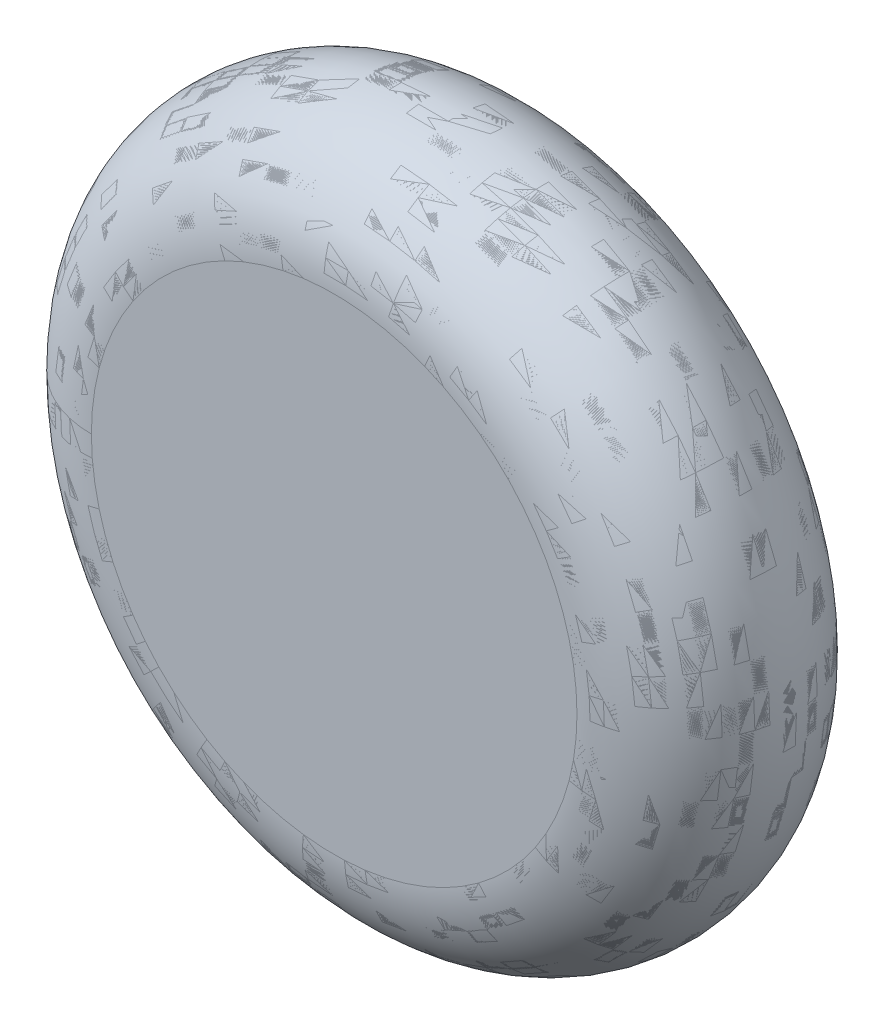
ISO-10303-21;
HEADER;
FILE_DESCRIPTION(('STEP AP214'),'2;1');
FILE_NAME('part.step','',(''),(''),'','','');
FILE_SCHEMA(('AUTOMOTIVE_DESIGN { 1 0 10303 214 1 1 1 1 }'));
ENDSEC;
DATA;
#1=APPLICATION_CONTEXT('core data for automotive mechanical design processes');
#2=APPLICATION_PROTOCOL_DEFINITION('international standard','automotive_design',2000,#1);
#3=PRODUCT_CONTEXT('',#1,'mechanical');
#4=PRODUCT('Part','Part','',(#3));
#5=PRODUCT_RELATED_PRODUCT_CATEGORY('part','',(#4));
#6=PRODUCT_DEFINITION_FORMATION('','',#4);
#7=PRODUCT_DEFINITION_CONTEXT('part definition',#1,'design');
#8=PRODUCT_DEFINITION('design','',#6,#7);
#9=PRODUCT_DEFINITION_SHAPE('','',#8);
#10=(LENGTH_UNIT() NAMED_UNIT(*) SI_UNIT(.MILLI.,.METRE.));
#11=(NAMED_UNIT(*) PLANE_ANGLE_UNIT() SI_UNIT($,.RADIAN.));
#12=(NAMED_UNIT(*) SI_UNIT($,.STERADIAN.) SOLID_ANGLE_UNIT());
#13=UNCERTAINTY_MEASURE_WITH_UNIT(LENGTH_MEASURE(1.E-05),#10,'distance_accuracy_value','');
#14=(GEOMETRIC_REPRESENTATION_CONTEXT(3) GLOBAL_UNCERTAINTY_ASSIGNED_CONTEXT((#13)) GLOBAL_UNIT_ASSIGNED_CONTEXT((#10,
#11,#12)) REPRESENTATION_CONTEXT('',''));
#15=CARTESIAN_POINT('',(0.,0.,0.));
#16=DIRECTION('',(0.,0.,1.));
#17=DIRECTION('',(1.,0.,0.));
#18=AXIS2_PLACEMENT_3D('',#15,#16,#17);
#19=CARTESIAN_POINT('',(0.,0.,20.));
#20=DIRECTION('',(0.,0.,-1.));
#21=DIRECTION('',(-1.,0.,0.));
#22=AXIS2_PLACEMENT_3D('',#19,#20,#21);
#23=TOROIDAL_SURFACE('',#22,45.,20.);
#24=CARTESIAN_POINT('',(0.,0.,0.));
#25=DIRECTION('',(0.,0.,-1.));
#26=DIRECTION('',(-1.,0.,0.));
#27=AXIS2_PLACEMENT_3D('',#24,#25,#26);
#28=CIRCLE('',#27,45.);
#29=CARTESIAN_POINT('',(-45.,0.,0.));
#30=VERTEX_POINT('',#29);
#31=EDGE_CURVE('E11',#30,#30,#28,.T.);
#32=ORIENTED_EDGE('',*,*,#31,.F.);
#33=EDGE_LOOP('',(#32));
#34=FACE_BOUND('',#33,.T.);
#35=CARTESIAN_POINT('',(0.,0.,40.));
#36=DIRECTION('',(0.,0.,-1.));
#37=DIRECTION('',(-1.,0.,0.));
#38=AXIS2_PLACEMENT_3D('',#35,#36,#37);
#39=CIRCLE('',#38,45.);
#40=CARTESIAN_POINT('',(-45.,0.,40.));
#41=VERTEX_POINT('',#40);
#42=EDGE_CURVE('E48',#41,#41,#39,.T.);
#43=ORIENTED_EDGE('',*,*,#42,.T.);
#44=EDGE_LOOP('',(#43));
#45=FACE_BOUND('',#44,.T.);
#46=ADVANCED_FACE('F42',(#34,#45),#23,.T.);
#47=CARTESIAN_POINT('',(0.,0.,0.));
#48=DIRECTION('',(0.,0.,-1.));
#49=DIRECTION('',(-1.,0.,0.));
#50=AXIS2_PLACEMENT_3D('',#47,#48,#49);
#51=CYLINDRICAL_SURFACE('',#50,45.);
#52=ORIENTED_EDGE('',*,*,#42,.F.);
#53=EDGE_LOOP('',(#52));
#54=FACE_BOUND('',#53,.T.);
#55=ORIENTED_EDGE('',*,*,#31,.T.);
#56=EDGE_LOOP('',(#55));
#57=FACE_BOUND('',#56,.T.);
#58=ADVANCED_FACE('F55',(#54,#57),#51,.F.);
#59=CLOSED_SHELL('',(#46,#58));
#60=MANIFOLD_SOLID_BREP('B2',#59);
#61=CARTESIAN_POINT('',(0.,0.,20.));
#62=DIRECTION('',(0.,0.,-1.));
#63=DIRECTION('',(-1.,0.,0.));
#64=AXIS2_PLACEMENT_3D('',#61,#62,#63);
#65=TOROIDAL_SURFACE('',#64,45.,20.);
#66=CARTESIAN_POINT('',(0.,0.,40.));
#67=DIRECTION('',(0.,0.,-1.));
#68=DIRECTION('',(-1.,0.,0.));
#69=AXIS2_PLACEMENT_3D('',#66,#67,#68);
#70=CIRCLE('',#69,45.);
#71=CARTESIAN_POINT('',(-45.,0.,40.));
#72=VERTEX_POINT('',#71);
#73=EDGE_CURVE('E41',#72,#72,#70,.T.);
#74=ORIENTED_EDGE('',*,*,#73,.T.);
#75=EDGE_LOOP('',(#74));
#76=FACE_BOUND('',#75,.T.);
#77=CARTESIAN_POINT('',(0.,0.,0.));
#78=DIRECTION('',(0.,0.,-1.));
#79=DIRECTION('',(-1.,0.,0.));
#80=AXIS2_PLACEMENT_3D('',#77,#78,#79);
#81=CIRCLE('',#80,45.);
#82=CARTESIAN_POINT('',(-45.,0.,0.));
#83=VERTEX_POINT('',#82);
#84=EDGE_CURVE('E89',#83,#83,#81,.T.);
#85=ORIENTED_EDGE('',*,*,#84,.F.);
#86=EDGE_LOOP('',(#85));
#87=FACE_BOUND('',#86,.T.);
#88=ADVANCED_FACE('F83',(#76,#87),#65,.T.);
#89=CARTESIAN_POINT('',(0.,0.,0.));
#90=DIRECTION('',(0.,0.,-1.));
#91=DIRECTION('',(-1.,0.,0.));
#92=AXIS2_PLACEMENT_3D('',#89,#90,#91);
#93=CYLINDRICAL_SURFACE('',#92,45.);
#94=ORIENTED_EDGE('',*,*,#84,.T.);
#95=EDGE_LOOP('',(#94));
#96=FACE_BOUND('',#95,.T.);
#97=ORIENTED_EDGE('',*,*,#73,.F.);
#98=EDGE_LOOP('',(#97));
#99=FACE_BOUND('',#98,.T.);
#100=ADVANCED_FACE('F95',(#96,#99),#93,.F.);
#101=CLOSED_SHELL('',(#88,#100));
#102=MANIFOLD_SOLID_BREP('B6',#101);
#103=CARTESIAN_POINT('',(0.,0.,40.));
#104=DIRECTION('',(0.,0.,-1.));
#105=DIRECTION('',(-1.,0.,0.));
#106=AXIS2_PLACEMENT_3D('',#103,#104,#105);
#107=CYLINDRICAL_SURFACE('',#106,45.);
#108=CARTESIAN_POINT('',(0.,0.,40.));
#109=DIRECTION('',(0.,0.,1.));
#110=DIRECTION('',(1.,0.,0.));
#111=AXIS2_PLACEMENT_3D('',#108,#109,#110);
#112=CIRCLE('',#111,45.);
#113=CARTESIAN_POINT('',(45.,0.,40.));
#114=VERTEX_POINT('',#113);
#115=EDGE_CURVE('E82',#114,#114,#112,.T.);
#116=ORIENTED_EDGE('',*,*,#115,.F.);
#117=EDGE_LOOP('',(#116));
#118=FACE_BOUND('',#117,.T.);
#119=CARTESIAN_POINT('',(0.,0.,0.));
#120=DIRECTION('',(0.,0.,1.));
#121=DIRECTION('',(1.,0.,0.));
#122=AXIS2_PLACEMENT_3D('',#119,#120,#121);
#123=CIRCLE('',#122,45.);
#124=CARTESIAN_POINT('',(45.,0.,0.));
#125=VERTEX_POINT('',#124);
#126=EDGE_CURVE('E118',#125,#125,#123,.T.);
#127=ORIENTED_EDGE('',*,*,#126,.T.);
#128=EDGE_LOOP('',(#127));
#129=FACE_BOUND('',#128,.T.);
#130=ADVANCED_FACE('F115',(#118,#129),#107,.T.);
#131=CARTESIAN_POINT('',(0.,0.,40.));
#132=DIRECTION('',(0.,0.,1.));
#133=DIRECTION('',(1.,0.,0.));
#134=AXIS2_PLACEMENT_3D('',#131,#132,#133);
#135=PLANE('',#134);
#136=ORIENTED_EDGE('',*,*,#115,.T.);
#137=EDGE_LOOP('',(#136));
#138=FACE_BOUND('',#137,.T.);
#139=ADVANCED_FACE('F130',(#138),#135,.T.);
#140=CARTESIAN_POINT('',(0.,0.,0.));
#141=DIRECTION('',(0.,0.,1.));
#142=DIRECTION('',(1.,0.,0.));
#143=AXIS2_PLACEMENT_3D('',#140,#141,#142);
#144=PLANE('',#143);
#145=ORIENTED_EDGE('',*,*,#126,.F.);
#146=EDGE_LOOP('',(#145));
#147=FACE_BOUND('',#146,.T.);
#148=ADVANCED_FACE('F128',(#147),#144,.F.);
#149=CLOSED_SHELL('',(#130,#139,#148));
#150=MANIFOLD_SOLID_BREP('B36',#149);
#151=ADVANCED_BREP_SHAPE_REPRESENTATION('',(#18,#60,#102,#150),#14);
#152=SHAPE_DEFINITION_REPRESENTATION(#9,#151);
ENDSEC;
END-ISO-10303-21;
